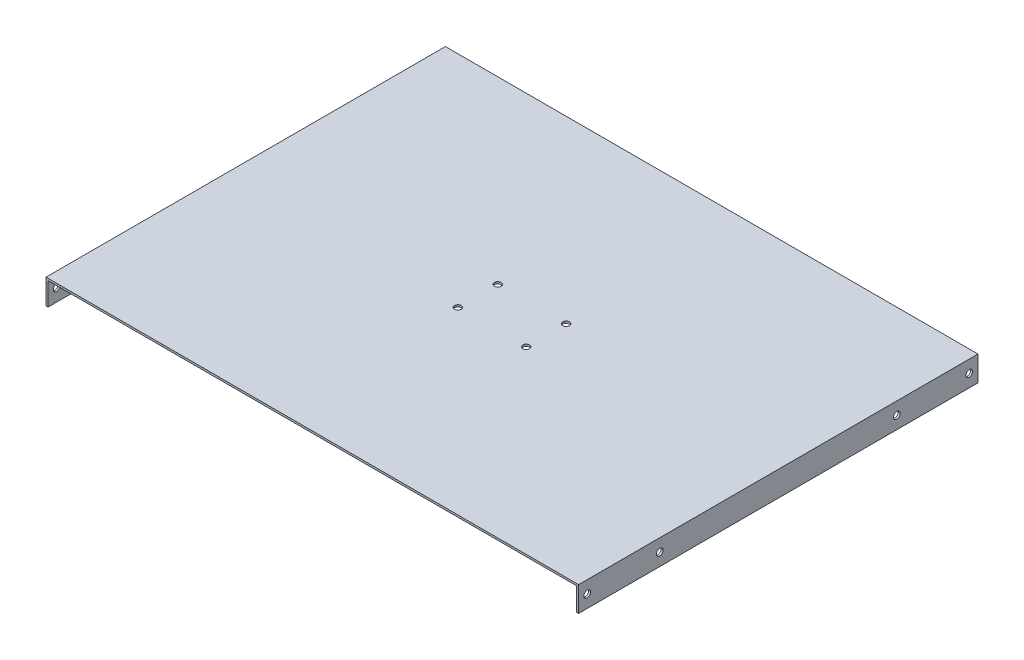
ISO-10303-21;
HEADER;
FILE_DESCRIPTION(('STEP AP214'),'2;1');
FILE_NAME('part.step','',(''),(''),'','','');
FILE_SCHEMA(('AUTOMOTIVE_DESIGN { 1 0 10303 214 1 1 1 1 }'));
ENDSEC;
DATA;
#1=APPLICATION_CONTEXT('core data for automotive mechanical design processes');
#2=APPLICATION_PROTOCOL_DEFINITION('international standard','automotive_design',2000,#1);
#3=PRODUCT_CONTEXT('',#1,'mechanical');
#4=PRODUCT('Part','Part','',(#3));
#5=PRODUCT_RELATED_PRODUCT_CATEGORY('part','',(#4));
#6=PRODUCT_DEFINITION_FORMATION('','',#4);
#7=PRODUCT_DEFINITION_CONTEXT('part definition',#1,'design');
#8=PRODUCT_DEFINITION('design','',#6,#7);
#9=PRODUCT_DEFINITION_SHAPE('','',#8);
#10=(LENGTH_UNIT() NAMED_UNIT(*) SI_UNIT(.MILLI.,.METRE.));
#11=(NAMED_UNIT(*) PLANE_ANGLE_UNIT() SI_UNIT($,.RADIAN.));
#12=(NAMED_UNIT(*) SI_UNIT($,.STERADIAN.) SOLID_ANGLE_UNIT());
#13=UNCERTAINTY_MEASURE_WITH_UNIT(LENGTH_MEASURE(1.E-05),#10,'distance_accuracy_value','');
#14=(GEOMETRIC_REPRESENTATION_CONTEXT(3) GLOBAL_UNCERTAINTY_ASSIGNED_CONTEXT((#13)) GLOBAL_UNIT_ASSIGNED_CONTEXT((#10,
#11,#12)) REPRESENTATION_CONTEXT('',''));
#15=CARTESIAN_POINT('',(0.,0.,0.));
#16=DIRECTION('',(0.,0.,1.));
#17=DIRECTION('',(1.,0.,0.));
#18=AXIS2_PLACEMENT_3D('',#15,#16,#17);
#19=CARTESIAN_POINT('',(0.,15.,0.));
#20=DIRECTION('',(0.,-1.,0.));
#21=DIRECTION('',(0.,0.,-1.));
#22=AXIS2_PLACEMENT_3D('',#19,#20,#21);
#23=PLANE('',#22);
#24=CARTESIAN_POINT('',(20.52,15.,12.));
#25=DIRECTION('',(0.,-1.,0.));
#26=DIRECTION('',(0.,0.,-1.));
#27=AXIS2_PLACEMENT_3D('',#24,#25,#26);
#28=CIRCLE('',#27,2.);
#29=CARTESIAN_POINT('',(20.52,15.,10.));
#30=VERTEX_POINT('',#29);
#31=EDGE_CURVE('E195',#30,#30,#28,.T.);
#32=ORIENTED_EDGE('',*,*,#31,.T.);
#33=EDGE_LOOP('',(#32));
#34=FACE_BOUND('',#33,.T.);
#35=CARTESIAN_POINT('',(-20.52,15.,-12.));
#36=DIRECTION('',(0.,-1.,0.));
#37=DIRECTION('',(0.,0.,-1.));
#38=AXIS2_PLACEMENT_3D('',#35,#36,#37);
#39=CIRCLE('',#38,2.);
#40=CARTESIAN_POINT('',(-20.52,15.,-14.));
#41=VERTEX_POINT('',#40);
#42=EDGE_CURVE('E184',#41,#41,#39,.T.);
#43=ORIENTED_EDGE('',*,*,#42,.T.);
#44=EDGE_LOOP('',(#43));
#45=FACE_BOUND('',#44,.T.);
#46=DIRECTION('',(0.,0.,-1.));
#47=VECTOR('',#46,1.);
#48=CARTESIAN_POINT('',(160.,15.,120.));
#49=LINE('',#48,#47);
#50=CARTESIAN_POINT('',(160.,15.,120.));
#51=VERTEX_POINT('',#50);
#52=CARTESIAN_POINT('',(160.,15.,-120.));
#53=VERTEX_POINT('',#52);
#54=EDGE_CURVE('E151',#51,#53,#49,.T.);
#55=ORIENTED_EDGE('',*,*,#54,.T.);
#56=DIRECTION('',(-1.,0.,0.));
#57=VECTOR('',#56,1.);
#58=CARTESIAN_POINT('',(-160.,15.,-120.));
#59=LINE('',#58,#57);
#60=CARTESIAN_POINT('',(-160.,15.,-120.));
#61=VERTEX_POINT('',#60);
#62=EDGE_CURVE('E93',#53,#61,#59,.T.);
#63=ORIENTED_EDGE('',*,*,#62,.T.);
#64=DIRECTION('',(0.,0.,1.));
#65=VECTOR('',#64,1.);
#66=CARTESIAN_POINT('',(-160.,15.,120.));
#67=LINE('',#66,#65);
#68=CARTESIAN_POINT('',(-160.,15.,120.));
#69=VERTEX_POINT('',#68);
#70=EDGE_CURVE('E157',#61,#69,#67,.T.);
#71=ORIENTED_EDGE('',*,*,#70,.T.);
#72=DIRECTION('',(1.,0.,0.));
#73=VECTOR('',#72,1.);
#74=CARTESIAN_POINT('',(-160.,15.,120.));
#75=LINE('',#74,#73);
#76=EDGE_CURVE('E65',#69,#51,#75,.T.);
#77=ORIENTED_EDGE('',*,*,#76,.T.);
#78=EDGE_LOOP('',(#55,#63,#71,#77));
#79=FACE_BOUND('',#78,.T.);
#80=CARTESIAN_POINT('',(20.52,15.,-12.));
#81=DIRECTION('',(0.,-1.,0.));
#82=DIRECTION('',(0.,0.,-1.));
#83=AXIS2_PLACEMENT_3D('',#80,#81,#82);
#84=CIRCLE('',#83,2.);
#85=CARTESIAN_POINT('',(20.52,15.,-14.));
#86=VERTEX_POINT('',#85);
#87=EDGE_CURVE('E190',#86,#86,#84,.F.);
#88=ORIENTED_EDGE('',*,*,#87,.F.);
#89=EDGE_LOOP('',(#88));
#90=FACE_BOUND('',#89,.T.);
#91=CARTESIAN_POINT('',(-20.52,15.,12.));
#92=DIRECTION('',(0.,-1.,0.));
#93=DIRECTION('',(0.,0.,-1.));
#94=AXIS2_PLACEMENT_3D('',#91,#92,#93);
#95=CIRCLE('',#94,2.);
#96=CARTESIAN_POINT('',(-20.52,15.,10.));
#97=VERTEX_POINT('',#96);
#98=EDGE_CURVE('E200',#97,#97,#95,.F.);
#99=ORIENTED_EDGE('',*,*,#98,.F.);
#100=EDGE_LOOP('',(#99));
#101=FACE_BOUND('',#100,.T.);
#102=ADVANCED_FACE('F38',(#34,#45,#79,#90,#101),#23,.F.);
#103=CARTESIAN_POINT('',(0.,13.8,0.));
#104=DIRECTION('',(0.,-1.,0.));
#105=DIRECTION('',(0.,0.,-1.));
#106=AXIS2_PLACEMENT_3D('',#103,#104,#105);
#107=PLANE('',#106);
#108=CARTESIAN_POINT('',(20.52,13.8,-12.));
#109=DIRECTION('',(0.,-1.,0.));
#110=DIRECTION('',(0.,0.,-1.));
#111=AXIS2_PLACEMENT_3D('',#108,#109,#110);
#112=CIRCLE('',#111,2.);
#113=CARTESIAN_POINT('',(20.52,13.8,-14.));
#114=VERTEX_POINT('',#113);
#115=EDGE_CURVE('E186',#114,#114,#112,.F.);
#116=ORIENTED_EDGE('',*,*,#115,.T.);
#117=EDGE_LOOP('',(#116));
#118=FACE_BOUND('',#117,.T.);
#119=CARTESIAN_POINT('',(-20.52,13.8,-12.));
#120=DIRECTION('',(0.,-1.,0.));
#121=DIRECTION('',(0.,0.,-1.));
#122=AXIS2_PLACEMENT_3D('',#119,#120,#121);
#123=CIRCLE('',#122,2.);
#124=CARTESIAN_POINT('',(-20.52,13.8,-14.));
#125=VERTEX_POINT('',#124);
#126=EDGE_CURVE('E180',#125,#125,#123,.T.);
#127=ORIENTED_EDGE('',*,*,#126,.F.);
#128=EDGE_LOOP('',(#127));
#129=FACE_BOUND('',#128,.T.);
#130=DIRECTION('',(0.,0.,-1.));
#131=VECTOR('',#130,1.);
#132=CARTESIAN_POINT('',(158.8,13.8,120.));
#133=LINE('',#132,#131);
#134=CARTESIAN_POINT('',(158.8,13.8,120.));
#135=VERTEX_POINT('',#134);
#136=CARTESIAN_POINT('',(158.8,13.8,-120.));
#137=VERTEX_POINT('',#136);
#138=EDGE_CURVE('E121',#135,#137,#133,.T.);
#139=ORIENTED_EDGE('',*,*,#138,.F.);
#140=DIRECTION('',(1.,0.,0.));
#141=VECTOR('',#140,1.);
#142=CARTESIAN_POINT('',(-158.8,13.8,120.));
#143=LINE('',#142,#141);
#144=CARTESIAN_POINT('',(-158.8,13.8,120.));
#145=VERTEX_POINT('',#144);
#146=EDGE_CURVE('E266',#145,#135,#143,.T.);
#147=ORIENTED_EDGE('',*,*,#146,.F.);
#148=DIRECTION('',(0.,0.,1.));
#149=VECTOR('',#148,1.);
#150=CARTESIAN_POINT('',(-158.8,13.8,120.));
#151=LINE('',#150,#149);
#152=CARTESIAN_POINT('',(-158.8,13.8,-120.));
#153=VERTEX_POINT('',#152);
#154=EDGE_CURVE('E123',#153,#145,#151,.T.);
#155=ORIENTED_EDGE('',*,*,#154,.F.);
#156=DIRECTION('',(-1.,0.,0.));
#157=VECTOR('',#156,1.);
#158=CARTESIAN_POINT('',(-158.8,13.8,-120.));
#159=LINE('',#158,#157);
#160=EDGE_CURVE('E116',#137,#153,#159,.T.);
#161=ORIENTED_EDGE('',*,*,#160,.F.);
#162=EDGE_LOOP('',(#139,#147,#155,#161));
#163=FACE_BOUND('',#162,.T.);
#164=CARTESIAN_POINT('',(20.52,13.8,12.));
#165=DIRECTION('',(0.,-1.,0.));
#166=DIRECTION('',(0.,0.,-1.));
#167=AXIS2_PLACEMENT_3D('',#164,#165,#166);
#168=CIRCLE('',#167,2.);
#169=CARTESIAN_POINT('',(20.52,13.8,10.));
#170=VERTEX_POINT('',#169);
#171=EDGE_CURVE('E191',#170,#170,#168,.T.);
#172=ORIENTED_EDGE('',*,*,#171,.F.);
#173=EDGE_LOOP('',(#172));
#174=FACE_BOUND('',#173,.T.);
#175=CARTESIAN_POINT('',(-20.52,13.8,12.));
#176=DIRECTION('',(0.,-1.,0.));
#177=DIRECTION('',(0.,0.,-1.));
#178=AXIS2_PLACEMENT_3D('',#175,#176,#177);
#179=CIRCLE('',#178,2.);
#180=CARTESIAN_POINT('',(-20.52,13.8,10.));
#181=VERTEX_POINT('',#180);
#182=EDGE_CURVE('E196',#181,#181,#179,.F.);
#183=ORIENTED_EDGE('',*,*,#182,.T.);
#184=EDGE_LOOP('',(#183));
#185=FACE_BOUND('',#184,.T.);
#186=ADVANCED_FACE('F118',(#118,#129,#163,#174,#185),#107,.T.);
#187=CARTESIAN_POINT('',(-160.,15.,-120.));
#188=DIRECTION('',(0.,0.,1.));
#189=DIRECTION('',(1.,0.,0.));
#190=AXIS2_PLACEMENT_3D('',#187,#188,#189);
#191=PLANE('',#190);
#192=DIRECTION('',(0.,-1.,0.));
#193=VECTOR('',#192,1.);
#194=CARTESIAN_POINT('',(158.8,13.8,-120.));
#195=LINE('',#194,#193);
#196=CARTESIAN_POINT('',(158.8,0.,-120.));
#197=VERTEX_POINT('',#196);
#198=EDGE_CURVE('E130',#137,#197,#195,.T.);
#199=ORIENTED_EDGE('',*,*,#198,.F.);
#200=ORIENTED_EDGE('',*,*,#160,.T.);
#201=DIRECTION('',(0.,-1.,0.));
#202=VECTOR('',#201,1.);
#203=CARTESIAN_POINT('',(-158.8,13.8,-120.));
#204=LINE('',#203,#202);
#205=CARTESIAN_POINT('',(-158.8,0.,-120.));
#206=VERTEX_POINT('',#205);
#207=EDGE_CURVE('E141',#153,#206,#204,.T.);
#208=ORIENTED_EDGE('',*,*,#207,.T.);
#209=DIRECTION('',(-1.,0.,0.));
#210=VECTOR('',#209,1.);
#211=CARTESIAN_POINT('',(-160.,0.,-120.));
#212=LINE('',#211,#210);
#213=CARTESIAN_POINT('',(-160.,0.,-120.));
#214=VERTEX_POINT('',#213);
#215=EDGE_CURVE('E146',#206,#214,#212,.T.);
#216=ORIENTED_EDGE('',*,*,#215,.T.);
#217=DIRECTION('',(0.,-1.,0.));
#218=VECTOR('',#217,1.);
#219=CARTESIAN_POINT('',(-160.,15.,-120.));
#220=LINE('',#219,#218);
#221=EDGE_CURVE('E48',#61,#214,#220,.T.);
#222=ORIENTED_EDGE('',*,*,#221,.F.);
#223=ORIENTED_EDGE('',*,*,#62,.F.);
#224=DIRECTION('',(0.,-1.,0.));
#225=VECTOR('',#224,1.);
#226=CARTESIAN_POINT('',(160.,15.,-120.));
#227=LINE('',#226,#225);
#228=CARTESIAN_POINT('',(160.,0.,-120.));
#229=VERTEX_POINT('',#228);
#230=EDGE_CURVE('E11',#53,#229,#227,.T.);
#231=ORIENTED_EDGE('',*,*,#230,.T.);
#232=EDGE_CURVE('E138',#229,#197,#212,.T.);
#233=ORIENTED_EDGE('',*,*,#232,.T.);
#234=EDGE_LOOP('',(#199,#200,#208,#216,#222,#223,#231,#233));
#235=FACE_BOUND('',#234,.T.);
#236=ADVANCED_FACE('F137',(#235),#191,.F.);
#237=CARTESIAN_POINT('',(-160.,15.,120.));
#238=DIRECTION('',(0.,0.,-1.));
#239=DIRECTION('',(-1.,0.,0.));
#240=AXIS2_PLACEMENT_3D('',#237,#238,#239);
#241=PLANE('',#240);
#242=DIRECTION('',(0.,-1.,0.));
#243=VECTOR('',#242,1.);
#244=CARTESIAN_POINT('',(158.8,13.8,120.));
#245=LINE('',#244,#243);
#246=CARTESIAN_POINT('',(158.8,0.,120.));
#247=VERTEX_POINT('',#246);
#248=EDGE_CURVE('E132',#135,#247,#245,.T.);
#249=ORIENTED_EDGE('',*,*,#248,.T.);
#250=DIRECTION('',(1.,0.,0.));
#251=VECTOR('',#250,1.);
#252=CARTESIAN_POINT('',(-160.,0.,120.));
#253=LINE('',#252,#251);
#254=CARTESIAN_POINT('',(160.,0.,120.));
#255=VERTEX_POINT('',#254);
#256=EDGE_CURVE('E86',#247,#255,#253,.T.);
#257=ORIENTED_EDGE('',*,*,#256,.T.);
#258=DIRECTION('',(0.,-1.,0.));
#259=VECTOR('',#258,1.);
#260=CARTESIAN_POINT('',(160.,15.,120.));
#261=LINE('',#260,#259);
#262=EDGE_CURVE('E161',#51,#255,#261,.T.);
#263=ORIENTED_EDGE('',*,*,#262,.F.);
#264=ORIENTED_EDGE('',*,*,#76,.F.);
#265=DIRECTION('',(0.,-1.,0.));
#266=VECTOR('',#265,1.);
#267=CARTESIAN_POINT('',(-160.,15.,120.));
#268=LINE('',#267,#266);
#269=CARTESIAN_POINT('',(-160.,0.,120.));
#270=VERTEX_POINT('',#269);
#271=EDGE_CURVE('E173',#69,#270,#268,.T.);
#272=ORIENTED_EDGE('',*,*,#271,.T.);
#273=CARTESIAN_POINT('',(-158.8,0.,120.));
#274=VERTEX_POINT('',#273);
#275=EDGE_CURVE('E154',#270,#274,#253,.T.);
#276=ORIENTED_EDGE('',*,*,#275,.T.);
#277=DIRECTION('',(0.,-1.,0.));
#278=VECTOR('',#277,1.);
#279=CARTESIAN_POINT('',(-158.8,13.8,120.));
#280=LINE('',#279,#278);
#281=EDGE_CURVE('E56',#145,#274,#280,.T.);
#282=ORIENTED_EDGE('',*,*,#281,.F.);
#283=ORIENTED_EDGE('',*,*,#146,.T.);
#284=EDGE_LOOP('',(#249,#257,#263,#264,#272,#276,#282,#283));
#285=FACE_BOUND('',#284,.T.);
#286=ADVANCED_FACE('F308',(#285),#241,.F.);
#287=CARTESIAN_POINT('',(0.,0.,0.));
#288=DIRECTION('',(0.,-1.,0.));
#289=DIRECTION('',(0.,0.,-1.));
#290=AXIS2_PLACEMENT_3D('',#287,#288,#289);
#291=PLANE('',#290);
#292=ORIENTED_EDGE('',*,*,#256,.F.);
#293=DIRECTION('',(0.,0.,-1.));
#294=VECTOR('',#293,1.);
#295=CARTESIAN_POINT('',(158.8,0.,120.));
#296=LINE('',#295,#294);
#297=EDGE_CURVE('E262',#247,#197,#296,.T.);
#298=ORIENTED_EDGE('',*,*,#297,.T.);
#299=ORIENTED_EDGE('',*,*,#232,.F.);
#300=DIRECTION('',(0.,0.,-1.));
#301=VECTOR('',#300,1.);
#302=CARTESIAN_POINT('',(160.,0.,120.));
#303=LINE('',#302,#301);
#304=EDGE_CURVE('E140',#255,#229,#303,.T.);
#305=ORIENTED_EDGE('',*,*,#304,.F.);
#306=EDGE_LOOP('',(#292,#298,#299,#305));
#307=FACE_BOUND('',#306,.T.);
#308=ADVANCED_FACE('F318',(#307),#291,.T.);
#309=ORIENTED_EDGE('',*,*,#215,.F.);
#310=DIRECTION('',(0.,0.,1.));
#311=VECTOR('',#310,1.);
#312=CARTESIAN_POINT('',(-158.8,0.,120.));
#313=LINE('',#312,#311);
#314=EDGE_CURVE('E134',#206,#274,#313,.T.);
#315=ORIENTED_EDGE('',*,*,#314,.T.);
#316=ORIENTED_EDGE('',*,*,#275,.F.);
#317=DIRECTION('',(0.,0.,1.));
#318=VECTOR('',#317,1.);
#319=CARTESIAN_POINT('',(-160.,0.,120.));
#320=LINE('',#319,#318);
#321=EDGE_CURVE('E165',#214,#270,#320,.T.);
#322=ORIENTED_EDGE('',*,*,#321,.F.);
#323=EDGE_LOOP('',(#309,#315,#316,#322));
#324=FACE_BOUND('',#323,.T.);
#325=ADVANCED_FACE('F309',(#324),#291,.T.);
#326=CARTESIAN_POINT('',(160.,15.,120.));
#327=DIRECTION('',(-1.,0.,0.));
#328=DIRECTION('',(0.,0.,1.));
#329=AXIS2_PLACEMENT_3D('',#326,#327,#328);
#330=PLANE('',#329);
#331=CARTESIAN_POINT('',(160.,7.5,-114.8));
#332=DIRECTION('',(-1.,0.,0.));
#333=DIRECTION('',(0.,0.,1.));
#334=AXIS2_PLACEMENT_3D('',#331,#332,#333);
#335=CIRCLE('',#334,2.);
#336=CARTESIAN_POINT('',(160.,7.5,-112.8));
#337=VERTEX_POINT('',#336);
#338=EDGE_CURVE('E185',#337,#337,#335,.F.);
#339=ORIENTED_EDGE('',*,*,#338,.F.);
#340=EDGE_LOOP('',(#339));
#341=FACE_BOUND('',#340,.T.);
#342=CARTESIAN_POINT('',(160.,7.5,71.2));
#343=DIRECTION('',(-1.,0.,0.));
#344=DIRECTION('',(0.,0.,1.));
#345=AXIS2_PLACEMENT_3D('',#342,#343,#344);
#346=CIRCLE('',#345,2.);
#347=CARTESIAN_POINT('',(160.,7.5,73.2));
#348=VERTEX_POINT('',#347);
#349=EDGE_CURVE('E236',#348,#348,#346,.F.);
#350=ORIENTED_EDGE('',*,*,#349,.F.);
#351=EDGE_LOOP('',(#350));
#352=FACE_BOUND('',#351,.T.);
#353=CARTESIAN_POINT('',(160.,7.5,114.8));
#354=DIRECTION('',(-1.,0.,0.));
#355=DIRECTION('',(0.,0.,1.));
#356=AXIS2_PLACEMENT_3D('',#353,#354,#355);
#357=CIRCLE('',#356,2.);
#358=CARTESIAN_POINT('',(160.,7.5,116.8));
#359=VERTEX_POINT('',#358);
#360=EDGE_CURVE('E215',#359,#359,#357,.F.);
#361=ORIENTED_EDGE('',*,*,#360,.F.);
#362=EDGE_LOOP('',(#361));
#363=FACE_BOUND('',#362,.T.);
#364=CARTESIAN_POINT('',(160.,7.5,-71.2));
#365=DIRECTION('',(-1.,0.,0.));
#366=DIRECTION('',(0.,0.,1.));
#367=AXIS2_PLACEMENT_3D('',#364,#365,#366);
#368=CIRCLE('',#367,2.);
#369=CARTESIAN_POINT('',(160.,7.5,-69.2));
#370=VERTEX_POINT('',#369);
#371=EDGE_CURVE('E210',#370,#370,#368,.F.);
#372=ORIENTED_EDGE('',*,*,#371,.F.);
#373=EDGE_LOOP('',(#372));
#374=FACE_BOUND('',#373,.T.);
#375=ORIENTED_EDGE('',*,*,#304,.T.);
#376=ORIENTED_EDGE('',*,*,#230,.F.);
#377=ORIENTED_EDGE('',*,*,#54,.F.);
#378=ORIENTED_EDGE('',*,*,#262,.T.);
#379=EDGE_LOOP('',(#375,#376,#377,#378));
#380=FACE_BOUND('',#379,.T.);
#381=ADVANCED_FACE('F40',(#341,#352,#363,#374,#380),#330,.F.);
#382=CARTESIAN_POINT('',(-160.,15.,120.));
#383=DIRECTION('',(1.,0.,0.));
#384=DIRECTION('',(0.,0.,-1.));
#385=AXIS2_PLACEMENT_3D('',#382,#383,#384);
#386=PLANE('',#385);
#387=CARTESIAN_POINT('',(-160.,7.5,-114.8));
#388=DIRECTION('',(1.,0.,0.));
#389=DIRECTION('',(0.,0.,-1.));
#390=AXIS2_PLACEMENT_3D('',#387,#388,#389);
#391=CIRCLE('',#390,2.);
#392=CARTESIAN_POINT('',(-160.,7.5,-116.8));
#393=VERTEX_POINT('',#392);
#394=EDGE_CURVE('E244',#393,#393,#391,.F.);
#395=ORIENTED_EDGE('',*,*,#394,.F.);
#396=EDGE_LOOP('',(#395));
#397=FACE_BOUND('',#396,.T.);
#398=CARTESIAN_POINT('',(-160.,7.5,71.2));
#399=DIRECTION('',(1.,0.,0.));
#400=DIRECTION('',(0.,0.,-1.));
#401=AXIS2_PLACEMENT_3D('',#398,#399,#400);
#402=CIRCLE('',#401,2.);
#403=CARTESIAN_POINT('',(-160.,7.5,69.2));
#404=VERTEX_POINT('',#403);
#405=EDGE_CURVE('E221',#404,#404,#402,.F.);
#406=ORIENTED_EDGE('',*,*,#405,.F.);
#407=EDGE_LOOP('',(#406));
#408=FACE_BOUND('',#407,.T.);
#409=CARTESIAN_POINT('',(-160.,7.5,114.8));
#410=DIRECTION('',(1.,0.,0.));
#411=DIRECTION('',(0.,0.,-1.));
#412=AXIS2_PLACEMENT_3D('',#409,#410,#411);
#413=CIRCLE('',#412,2.);
#414=CARTESIAN_POINT('',(-160.,7.5,112.8));
#415=VERTEX_POINT('',#414);
#416=EDGE_CURVE('E224',#415,#415,#413,.F.);
#417=ORIENTED_EDGE('',*,*,#416,.F.);
#418=EDGE_LOOP('',(#417));
#419=FACE_BOUND('',#418,.T.);
#420=CARTESIAN_POINT('',(-160.,7.5,-71.2));
#421=DIRECTION('',(1.,0.,0.));
#422=DIRECTION('',(0.,0.,-1.));
#423=AXIS2_PLACEMENT_3D('',#420,#421,#422);
#424=CIRCLE('',#423,2.);
#425=CARTESIAN_POINT('',(-160.,7.5,-73.2));
#426=VERTEX_POINT('',#425);
#427=EDGE_CURVE('E301',#426,#426,#424,.F.);
#428=ORIENTED_EDGE('',*,*,#427,.F.);
#429=EDGE_LOOP('',(#428));
#430=FACE_BOUND('',#429,.T.);
#431=ORIENTED_EDGE('',*,*,#321,.T.);
#432=ORIENTED_EDGE('',*,*,#271,.F.);
#433=ORIENTED_EDGE('',*,*,#70,.F.);
#434=ORIENTED_EDGE('',*,*,#221,.T.);
#435=EDGE_LOOP('',(#431,#432,#433,#434));
#436=FACE_BOUND('',#435,.T.);
#437=ADVANCED_FACE('F290',(#397,#408,#419,#430,#436),#386,.F.);
#438=CARTESIAN_POINT('',(158.8,13.8,120.));
#439=DIRECTION('',(-1.,0.,0.));
#440=DIRECTION('',(0.,0.,1.));
#441=AXIS2_PLACEMENT_3D('',#438,#439,#440);
#442=PLANE('',#441);
#443=CARTESIAN_POINT('',(158.8,7.5,-114.8));
#444=DIRECTION('',(-1.,0.,0.));
#445=DIRECTION('',(0.,0.,1.));
#446=AXIS2_PLACEMENT_3D('',#443,#444,#445);
#447=CIRCLE('',#446,2.);
#448=CARTESIAN_POINT('',(158.8,7.5,-112.8));
#449=VERTEX_POINT('',#448);
#450=EDGE_CURVE('E240',#449,#449,#447,.F.);
#451=ORIENTED_EDGE('',*,*,#450,.T.);
#452=EDGE_LOOP('',(#451));
#453=FACE_BOUND('',#452,.T.);
#454=CARTESIAN_POINT('',(158.8,7.5,71.2));
#455=DIRECTION('',(-1.,0.,0.));
#456=DIRECTION('',(0.,0.,1.));
#457=AXIS2_PLACEMENT_3D('',#454,#455,#456);
#458=CIRCLE('',#457,2.);
#459=CARTESIAN_POINT('',(158.8,7.5,73.2));
#460=VERTEX_POINT('',#459);
#461=EDGE_CURVE('E214',#460,#460,#458,.F.);
#462=ORIENTED_EDGE('',*,*,#461,.T.);
#463=EDGE_LOOP('',(#462));
#464=FACE_BOUND('',#463,.T.);
#465=CARTESIAN_POINT('',(158.8,7.5,114.8));
#466=DIRECTION('',(-1.,0.,0.));
#467=DIRECTION('',(0.,0.,1.));
#468=AXIS2_PLACEMENT_3D('',#465,#466,#467);
#469=CIRCLE('',#468,2.);
#470=CARTESIAN_POINT('',(158.8,7.5,116.8));
#471=VERTEX_POINT('',#470);
#472=EDGE_CURVE('E209',#471,#471,#469,.F.);
#473=ORIENTED_EDGE('',*,*,#472,.T.);
#474=EDGE_LOOP('',(#473));
#475=FACE_BOUND('',#474,.T.);
#476=CARTESIAN_POINT('',(158.8,7.5,-71.2));
#477=DIRECTION('',(-1.,0.,0.));
#478=DIRECTION('',(0.,0.,1.));
#479=AXIS2_PLACEMENT_3D('',#476,#477,#478);
#480=CIRCLE('',#479,2.);
#481=CARTESIAN_POINT('',(158.8,7.5,-69.2));
#482=VERTEX_POINT('',#481);
#483=EDGE_CURVE('E205',#482,#482,#480,.F.);
#484=ORIENTED_EDGE('',*,*,#483,.T.);
#485=EDGE_LOOP('',(#484));
#486=FACE_BOUND('',#485,.T.);
#487=ORIENTED_EDGE('',*,*,#297,.F.);
#488=ORIENTED_EDGE('',*,*,#248,.F.);
#489=ORIENTED_EDGE('',*,*,#138,.T.);
#490=ORIENTED_EDGE('',*,*,#198,.T.);
#491=EDGE_LOOP('',(#487,#488,#489,#490));
#492=FACE_BOUND('',#491,.T.);
#493=ADVANCED_FACE('F129',(#453,#464,#475,#486,#492),#442,.T.);
#494=CARTESIAN_POINT('',(-158.8,13.8,120.));
#495=DIRECTION('',(1.,0.,0.));
#496=DIRECTION('',(0.,0.,-1.));
#497=AXIS2_PLACEMENT_3D('',#494,#495,#496);
#498=PLANE('',#497);
#499=CARTESIAN_POINT('',(-158.8,7.5,-114.8));
#500=DIRECTION('',(1.,0.,0.));
#501=DIRECTION('',(0.,0.,-1.));
#502=AXIS2_PLACEMENT_3D('',#499,#500,#501);
#503=CIRCLE('',#502,2.);
#504=CARTESIAN_POINT('',(-158.8,7.5,-116.8));
#505=VERTEX_POINT('',#504);
#506=EDGE_CURVE('E42',#505,#505,#503,.F.);
#507=ORIENTED_EDGE('',*,*,#506,.T.);
#508=EDGE_LOOP('',(#507));
#509=FACE_BOUND('',#508,.T.);
#510=CARTESIAN_POINT('',(-158.8,7.5,71.2));
#511=DIRECTION('',(1.,0.,0.));
#512=DIRECTION('',(0.,0.,-1.));
#513=AXIS2_PLACEMENT_3D('',#510,#511,#512);
#514=CIRCLE('',#513,2.);
#515=CARTESIAN_POINT('',(-158.8,7.5,69.2));
#516=VERTEX_POINT('',#515);
#517=EDGE_CURVE('E211',#516,#516,#514,.F.);
#518=ORIENTED_EDGE('',*,*,#517,.T.);
#519=EDGE_LOOP('',(#518));
#520=FACE_BOUND('',#519,.T.);
#521=CARTESIAN_POINT('',(-158.8,7.5,114.8));
#522=DIRECTION('',(1.,0.,0.));
#523=DIRECTION('',(0.,0.,-1.));
#524=AXIS2_PLACEMENT_3D('',#521,#522,#523);
#525=CIRCLE('',#524,2.);
#526=CARTESIAN_POINT('',(-158.8,7.5,112.8));
#527=VERTEX_POINT('',#526);
#528=EDGE_CURVE('E206',#527,#527,#525,.F.);
#529=ORIENTED_EDGE('',*,*,#528,.T.);
#530=EDGE_LOOP('',(#529));
#531=FACE_BOUND('',#530,.T.);
#532=CARTESIAN_POINT('',(-158.8,7.5,-71.2));
#533=DIRECTION('',(1.,0.,0.));
#534=DIRECTION('',(0.,0.,-1.));
#535=AXIS2_PLACEMENT_3D('',#532,#533,#534);
#536=CIRCLE('',#535,2.);
#537=CARTESIAN_POINT('',(-158.8,7.5,-73.2));
#538=VERTEX_POINT('',#537);
#539=EDGE_CURVE('E201',#538,#538,#536,.F.);
#540=ORIENTED_EDGE('',*,*,#539,.T.);
#541=EDGE_LOOP('',(#540));
#542=FACE_BOUND('',#541,.T.);
#543=ORIENTED_EDGE('',*,*,#314,.F.);
#544=ORIENTED_EDGE('',*,*,#207,.F.);
#545=ORIENTED_EDGE('',*,*,#154,.T.);
#546=ORIENTED_EDGE('',*,*,#281,.T.);
#547=EDGE_LOOP('',(#543,#544,#545,#546));
#548=FACE_BOUND('',#547,.T.);
#549=ADVANCED_FACE('F279',(#509,#520,#531,#542,#548),#498,.T.);
#550=CARTESIAN_POINT('',(-20.52,23.8,-12.));
#551=DIRECTION('',(0.,-1.,0.));
#552=DIRECTION('',(0.,0.,-1.));
#553=AXIS2_PLACEMENT_3D('',#550,#551,#552);
#554=CYLINDRICAL_SURFACE('',#553,2.);
#555=CARTESIAN_POINT('',(-20.52,13.8,-14.));
#556=CARTESIAN_POINT('',(-20.52,13.8125,-14.));
#557=CARTESIAN_POINT('',(-20.52,13.825,-14.));
#558=CARTESIAN_POINT('',(-20.52,13.85,-14.));
#559=CARTESIAN_POINT('',(-20.52,13.8625,-14.));
#560=CARTESIAN_POINT('',(-20.52,13.8875,-14.));
#561=CARTESIAN_POINT('',(-20.52,13.9,-14.));
#562=CARTESIAN_POINT('',(-20.52,13.925,-14.));
#563=CARTESIAN_POINT('',(-20.52,13.9375,-14.));
#564=CARTESIAN_POINT('',(-20.52,13.9625,-14.));
#565=CARTESIAN_POINT('',(-20.52,13.975,-14.));
#566=CARTESIAN_POINT('',(-20.52,14.,-14.));
#567=CARTESIAN_POINT('',(-20.52,14.0125,-14.));
#568=CARTESIAN_POINT('',(-20.52,14.0375,-14.));
#569=CARTESIAN_POINT('',(-20.52,14.05,-14.));
#570=CARTESIAN_POINT('',(-20.52,14.075,-14.));
#571=CARTESIAN_POINT('',(-20.52,14.0875,-14.));
#572=CARTESIAN_POINT('',(-20.52,14.1125,-14.));
#573=CARTESIAN_POINT('',(-20.52,14.125,-14.));
#574=CARTESIAN_POINT('',(-20.52,14.15,-14.));
#575=CARTESIAN_POINT('',(-20.52,14.1625,-14.));
#576=CARTESIAN_POINT('',(-20.52,14.1875,-14.));
#577=CARTESIAN_POINT('',(-20.52,14.2,-14.));
#578=CARTESIAN_POINT('',(-20.52,14.225,-14.));
#579=CARTESIAN_POINT('',(-20.52,14.2375,-14.));
#580=CARTESIAN_POINT('',(-20.52,14.2625,-14.));
#581=CARTESIAN_POINT('',(-20.52,14.275,-14.));
#582=CARTESIAN_POINT('',(-20.52,14.3,-14.));
#583=CARTESIAN_POINT('',(-20.52,14.3125,-14.));
#584=CARTESIAN_POINT('',(-20.52,14.3375,-14.));
#585=CARTESIAN_POINT('',(-20.52,14.35,-14.));
#586=CARTESIAN_POINT('',(-20.52,14.375,-14.));
#587=CARTESIAN_POINT('',(-20.52,14.3875,-14.));
#588=CARTESIAN_POINT('',(-20.52,14.4125,-14.));
#589=CARTESIAN_POINT('',(-20.52,14.425,-14.));
#590=CARTESIAN_POINT('',(-20.52,14.45,-14.));
#591=CARTESIAN_POINT('',(-20.52,14.4625,-14.));
#592=CARTESIAN_POINT('',(-20.52,14.4875,-14.));
#593=CARTESIAN_POINT('',(-20.52,14.5,-14.));
#594=CARTESIAN_POINT('',(-20.52,14.525,-14.));
#595=CARTESIAN_POINT('',(-20.52,14.5375,-14.));
#596=CARTESIAN_POINT('',(-20.52,14.5625,-14.));
#597=CARTESIAN_POINT('',(-20.52,14.575,-14.));
#598=CARTESIAN_POINT('',(-20.52,14.6,-14.));
#599=CARTESIAN_POINT('',(-20.52,14.6125,-14.));
#600=CARTESIAN_POINT('',(-20.52,14.6375,-14.));
#601=CARTESIAN_POINT('',(-20.52,14.65,-14.));
#602=CARTESIAN_POINT('',(-20.52,14.675,-14.));
#603=CARTESIAN_POINT('',(-20.52,14.6875,-14.));
#604=CARTESIAN_POINT('',(-20.52,14.7125,-14.));
#605=CARTESIAN_POINT('',(-20.52,14.725,-14.));
#606=CARTESIAN_POINT('',(-20.52,14.75,-14.));
#607=CARTESIAN_POINT('',(-20.52,14.7625,-14.));
#608=CARTESIAN_POINT('',(-20.52,14.7875,-14.));
#609=CARTESIAN_POINT('',(-20.52,14.8,-14.));
#610=CARTESIAN_POINT('',(-20.52,14.825,-14.));
#611=CARTESIAN_POINT('',(-20.52,14.8375,-14.));
#612=CARTESIAN_POINT('',(-20.52,14.8625,-14.));
#613=CARTESIAN_POINT('',(-20.52,14.875,-14.));
#614=CARTESIAN_POINT('',(-20.52,14.9,-14.));
#615=CARTESIAN_POINT('',(-20.52,14.9125,-14.));
#616=CARTESIAN_POINT('',(-20.52,14.9375,-14.));
#617=CARTESIAN_POINT('',(-20.52,14.95,-14.));
#618=CARTESIAN_POINT('',(-20.52,14.975,-14.));
#619=CARTESIAN_POINT('',(-20.52,14.9875,-14.));
#620=CARTESIAN_POINT('',(-20.52,15.,-14.));
#621=B_SPLINE_CURVE_WITH_KNOTS('',3,(#555,#556,#557,#558,#559,#560,#561,#562,#563,#564,#565,
#566,#567,#568,#569,#570,#571,#572,#573,#574,#575,#576,#577,#578,#579,#580,#581,#582,#583,#584,
#585,#586,#587,#588,#589,#590,#591,#592,#593,#594,#595,#596,#597,#598,#599,#600,#601,#602,#603,
#604,#605,#606,#607,#608,#609,#610,#611,#612,#613,#614,#615,#616,#617,#618,#619,#620),
.UNSPECIFIED.,.F.,.F.,(4,2,2,2,2,2,2,2,2,2,2,2,2,2,2,2,2,2,2,2,2,2,2,2,2,2,2,2,2,2,2,2,4),(0.,
0.0374999999999993,0.0750000000000004,0.1125,0.150000000000001,0.1875,0.225,0.262500000000001,
0.3,0.337499999999999,0.375,0.4125,0.449999999999999,0.4875,0.524999999999999,0.5625,0.6,
0.637499999999999,0.675,0.7125,0.750000000000001,0.7875,0.824999999999999,0.8625,0.9,
0.937499999999999,0.975,1.0125,1.05,1.0875,1.125,1.1625,1.2),.UNSPECIFIED.);
#622=EDGE_CURVE('BSEAM341',#125,#41,#621,.T.);
#623=ORIENTED_EDGE('',*,*,#126,.T.);
#624=ORIENTED_EDGE('',*,*,#42,.F.);
#625=ORIENTED_EDGE('',*,*,#622,.T.);
#626=ORIENTED_EDGE('',*,*,#622,.F.);
#627=EDGE_LOOP('',(#623,#625,#624,#626));
#628=FACE_BOUND('',#627,.T.);
#629=ADVANCED_FACE('F341',(#628),#554,.F.);
#630=CARTESIAN_POINT('',(20.52,23.8,-12.));
#631=DIRECTION('',(0.,-1.,0.));
#632=DIRECTION('',(0.,0.,-1.));
#633=AXIS2_PLACEMENT_3D('',#630,#631,#632);
#634=CYLINDRICAL_SURFACE('',#633,2.);
#635=CARTESIAN_POINT('',(20.52,13.8,-14.));
#636=CARTESIAN_POINT('',(20.52,13.8125,-14.));
#637=CARTESIAN_POINT('',(20.52,13.825,-14.));
#638=CARTESIAN_POINT('',(20.52,13.85,-14.));
#639=CARTESIAN_POINT('',(20.52,13.8625,-14.));
#640=CARTESIAN_POINT('',(20.52,13.8875,-14.));
#641=CARTESIAN_POINT('',(20.52,13.9,-14.));
#642=CARTESIAN_POINT('',(20.52,13.925,-14.));
#643=CARTESIAN_POINT('',(20.52,13.9375,-14.));
#644=CARTESIAN_POINT('',(20.52,13.9625,-14.));
#645=CARTESIAN_POINT('',(20.52,13.975,-14.));
#646=CARTESIAN_POINT('',(20.52,14.,-14.));
#647=CARTESIAN_POINT('',(20.52,14.0125,-14.));
#648=CARTESIAN_POINT('',(20.52,14.0375,-14.));
#649=CARTESIAN_POINT('',(20.52,14.05,-14.));
#650=CARTESIAN_POINT('',(20.52,14.075,-14.));
#651=CARTESIAN_POINT('',(20.52,14.0875,-14.));
#652=CARTESIAN_POINT('',(20.52,14.1125,-14.));
#653=CARTESIAN_POINT('',(20.52,14.125,-14.));
#654=CARTESIAN_POINT('',(20.52,14.15,-14.));
#655=CARTESIAN_POINT('',(20.52,14.1625,-14.));
#656=CARTESIAN_POINT('',(20.52,14.1875,-14.));
#657=CARTESIAN_POINT('',(20.52,14.2,-14.));
#658=CARTESIAN_POINT('',(20.52,14.225,-14.));
#659=CARTESIAN_POINT('',(20.52,14.2375,-14.));
#660=CARTESIAN_POINT('',(20.52,14.2625,-14.));
#661=CARTESIAN_POINT('',(20.52,14.275,-14.));
#662=CARTESIAN_POINT('',(20.52,14.3,-14.));
#663=CARTESIAN_POINT('',(20.52,14.3125,-14.));
#664=CARTESIAN_POINT('',(20.52,14.3375,-14.));
#665=CARTESIAN_POINT('',(20.52,14.35,-14.));
#666=CARTESIAN_POINT('',(20.52,14.375,-14.));
#667=CARTESIAN_POINT('',(20.52,14.3875,-14.));
#668=CARTESIAN_POINT('',(20.52,14.4125,-14.));
#669=CARTESIAN_POINT('',(20.52,14.425,-14.));
#670=CARTESIAN_POINT('',(20.52,14.45,-14.));
#671=CARTESIAN_POINT('',(20.52,14.4625,-14.));
#672=CARTESIAN_POINT('',(20.52,14.4875,-14.));
#673=CARTESIAN_POINT('',(20.52,14.5,-14.));
#674=CARTESIAN_POINT('',(20.52,14.525,-14.));
#675=CARTESIAN_POINT('',(20.52,14.5375,-14.));
#676=CARTESIAN_POINT('',(20.52,14.5625,-14.));
#677=CARTESIAN_POINT('',(20.52,14.575,-14.));
#678=CARTESIAN_POINT('',(20.52,14.6,-14.));
#679=CARTESIAN_POINT('',(20.52,14.6125,-14.));
#680=CARTESIAN_POINT('',(20.52,14.6375,-14.));
#681=CARTESIAN_POINT('',(20.52,14.65,-14.));
#682=CARTESIAN_POINT('',(20.52,14.675,-14.));
#683=CARTESIAN_POINT('',(20.52,14.6875,-14.));
#684=CARTESIAN_POINT('',(20.52,14.7125,-14.));
#685=CARTESIAN_POINT('',(20.52,14.725,-14.));
#686=CARTESIAN_POINT('',(20.52,14.75,-14.));
#687=CARTESIAN_POINT('',(20.52,14.7625,-14.));
#688=CARTESIAN_POINT('',(20.52,14.7875,-14.));
#689=CARTESIAN_POINT('',(20.52,14.8,-14.));
#690=CARTESIAN_POINT('',(20.52,14.825,-14.));
#691=CARTESIAN_POINT('',(20.52,14.8375,-14.));
#692=CARTESIAN_POINT('',(20.52,14.8625,-14.));
#693=CARTESIAN_POINT('',(20.52,14.875,-14.));
#694=CARTESIAN_POINT('',(20.52,14.9,-14.));
#695=CARTESIAN_POINT('',(20.52,14.9125,-14.));
#696=CARTESIAN_POINT('',(20.52,14.9375,-14.));
#697=CARTESIAN_POINT('',(20.52,14.95,-14.));
#698=CARTESIAN_POINT('',(20.52,14.975,-14.));
#699=CARTESIAN_POINT('',(20.52,14.9875,-14.));
#700=CARTESIAN_POINT('',(20.52,15.,-14.));
#701=B_SPLINE_CURVE_WITH_KNOTS('',3,(#635,#636,#637,#638,#639,#640,#641,#642,#643,#644,#645,
#646,#647,#648,#649,#650,#651,#652,#653,#654,#655,#656,#657,#658,#659,#660,#661,#662,#663,#664,
#665,#666,#667,#668,#669,#670,#671,#672,#673,#674,#675,#676,#677,#678,#679,#680,#681,#682,#683,
#684,#685,#686,#687,#688,#689,#690,#691,#692,#693,#694,#695,#696,#697,#698,#699,#700),
.UNSPECIFIED.,.F.,.F.,(4,2,2,2,2,2,2,2,2,2,2,2,2,2,2,2,2,2,2,2,2,2,2,2,2,2,2,2,2,2,2,2,4),(0.,
0.0374999999999993,0.0750000000000004,0.1125,0.150000000000001,0.1875,0.225,0.262500000000001,
0.3,0.337499999999999,0.375,0.4125,0.449999999999999,0.4875,0.524999999999999,0.5625,0.6,
0.637499999999999,0.675,0.7125,0.750000000000001,0.7875,0.824999999999999,0.8625,0.9,
0.937499999999999,0.975,1.0125,1.05,1.0875,1.125,1.1625,1.2),.UNSPECIFIED.);
#702=EDGE_CURVE('BSEAM345',#114,#86,#701,.T.);
#703=ORIENTED_EDGE('',*,*,#115,.F.);
#704=ORIENTED_EDGE('',*,*,#87,.T.);
#705=ORIENTED_EDGE('',*,*,#702,.T.);
#706=ORIENTED_EDGE('',*,*,#702,.F.);
#707=EDGE_LOOP('',(#703,#705,#704,#706));
#708=FACE_BOUND('',#707,.T.);
#709=ADVANCED_FACE('F345',(#708),#634,.F.);
#710=CARTESIAN_POINT('',(20.52,23.8,12.));
#711=DIRECTION('',(0.,-1.,0.));
#712=DIRECTION('',(0.,0.,-1.));
#713=AXIS2_PLACEMENT_3D('',#710,#711,#712);
#714=CYLINDRICAL_SURFACE('',#713,2.);
#715=CARTESIAN_POINT('',(20.52,13.8,10.));
#716=CARTESIAN_POINT('',(20.52,13.8125,10.));
#717=CARTESIAN_POINT('',(20.52,13.825,10.));
#718=CARTESIAN_POINT('',(20.52,13.85,10.));
#719=CARTESIAN_POINT('',(20.52,13.8625,10.));
#720=CARTESIAN_POINT('',(20.52,13.8875,10.));
#721=CARTESIAN_POINT('',(20.52,13.9,10.));
#722=CARTESIAN_POINT('',(20.52,13.925,10.));
#723=CARTESIAN_POINT('',(20.52,13.9375,10.));
#724=CARTESIAN_POINT('',(20.52,13.9625,10.));
#725=CARTESIAN_POINT('',(20.52,13.975,10.));
#726=CARTESIAN_POINT('',(20.52,14.,10.));
#727=CARTESIAN_POINT('',(20.52,14.0125,10.));
#728=CARTESIAN_POINT('',(20.52,14.0375,10.));
#729=CARTESIAN_POINT('',(20.52,14.05,10.));
#730=CARTESIAN_POINT('',(20.52,14.075,10.));
#731=CARTESIAN_POINT('',(20.52,14.0875,10.));
#732=CARTESIAN_POINT('',(20.52,14.1125,10.));
#733=CARTESIAN_POINT('',(20.52,14.125,10.));
#734=CARTESIAN_POINT('',(20.52,14.15,10.));
#735=CARTESIAN_POINT('',(20.52,14.1625,10.));
#736=CARTESIAN_POINT('',(20.52,14.1875,10.));
#737=CARTESIAN_POINT('',(20.52,14.2,10.));
#738=CARTESIAN_POINT('',(20.52,14.225,10.));
#739=CARTESIAN_POINT('',(20.52,14.2375,10.));
#740=CARTESIAN_POINT('',(20.52,14.2625,10.));
#741=CARTESIAN_POINT('',(20.52,14.275,10.));
#742=CARTESIAN_POINT('',(20.52,14.3,10.));
#743=CARTESIAN_POINT('',(20.52,14.3125,10.));
#744=CARTESIAN_POINT('',(20.52,14.3375,10.));
#745=CARTESIAN_POINT('',(20.52,14.35,10.));
#746=CARTESIAN_POINT('',(20.52,14.375,10.));
#747=CARTESIAN_POINT('',(20.52,14.3875,10.));
#748=CARTESIAN_POINT('',(20.52,14.4125,10.));
#749=CARTESIAN_POINT('',(20.52,14.425,10.));
#750=CARTESIAN_POINT('',(20.52,14.45,10.));
#751=CARTESIAN_POINT('',(20.52,14.4625,10.));
#752=CARTESIAN_POINT('',(20.52,14.4875,10.));
#753=CARTESIAN_POINT('',(20.52,14.5,10.));
#754=CARTESIAN_POINT('',(20.52,14.525,10.));
#755=CARTESIAN_POINT('',(20.52,14.5375,10.));
#756=CARTESIAN_POINT('',(20.52,14.5625,10.));
#757=CARTESIAN_POINT('',(20.52,14.575,10.));
#758=CARTESIAN_POINT('',(20.52,14.6,10.));
#759=CARTESIAN_POINT('',(20.52,14.6125,10.));
#760=CARTESIAN_POINT('',(20.52,14.6375,10.));
#761=CARTESIAN_POINT('',(20.52,14.65,10.));
#762=CARTESIAN_POINT('',(20.52,14.675,10.));
#763=CARTESIAN_POINT('',(20.52,14.6875,10.));
#764=CARTESIAN_POINT('',(20.52,14.7125,10.));
#765=CARTESIAN_POINT('',(20.52,14.725,10.));
#766=CARTESIAN_POINT('',(20.52,14.75,10.));
#767=CARTESIAN_POINT('',(20.52,14.7625,10.));
#768=CARTESIAN_POINT('',(20.52,14.7875,10.));
#769=CARTESIAN_POINT('',(20.52,14.8,10.));
#770=CARTESIAN_POINT('',(20.52,14.825,10.));
#771=CARTESIAN_POINT('',(20.52,14.8375,10.));
#772=CARTESIAN_POINT('',(20.52,14.8625,10.));
#773=CARTESIAN_POINT('',(20.52,14.875,10.));
#774=CARTESIAN_POINT('',(20.52,14.9,10.));
#775=CARTESIAN_POINT('',(20.52,14.9125,10.));
#776=CARTESIAN_POINT('',(20.52,14.9375,10.));
#777=CARTESIAN_POINT('',(20.52,14.95,10.));
#778=CARTESIAN_POINT('',(20.52,14.975,10.));
#779=CARTESIAN_POINT('',(20.52,14.9875,10.));
#780=CARTESIAN_POINT('',(20.52,15.,10.));
#781=B_SPLINE_CURVE_WITH_KNOTS('',3,(#715,#716,#717,#718,#719,#720,#721,#722,#723,#724,#725,
#726,#727,#728,#729,#730,#731,#732,#733,#734,#735,#736,#737,#738,#739,#740,#741,#742,#743,#744,
#745,#746,#747,#748,#749,#750,#751,#752,#753,#754,#755,#756,#757,#758,#759,#760,#761,#762,#763,
#764,#765,#766,#767,#768,#769,#770,#771,#772,#773,#774,#775,#776,#777,#778,#779,#780),
.UNSPECIFIED.,.F.,.F.,(4,2,2,2,2,2,2,2,2,2,2,2,2,2,2,2,2,2,2,2,2,2,2,2,2,2,2,2,2,2,2,2,4),(0.,
0.0374999999999993,0.0750000000000004,0.1125,0.150000000000001,0.1875,0.225,0.262500000000001,
0.3,0.337499999999999,0.375,0.4125,0.449999999999999,0.4875,0.524999999999999,0.5625,0.6,
0.637499999999999,0.675,0.7125,0.750000000000001,0.7875,0.824999999999999,0.8625,0.9,
0.937499999999999,0.975,1.0125,1.05,1.0875,1.125,1.1625,1.2),.UNSPECIFIED.);
#782=EDGE_CURVE('BSEAM351',#170,#30,#781,.T.);
#783=ORIENTED_EDGE('',*,*,#171,.T.);
#784=ORIENTED_EDGE('',*,*,#31,.F.);
#785=ORIENTED_EDGE('',*,*,#782,.T.);
#786=ORIENTED_EDGE('',*,*,#782,.F.);
#787=EDGE_LOOP('',(#783,#785,#784,#786));
#788=FACE_BOUND('',#787,.T.);
#789=ADVANCED_FACE('F351',(#788),#714,.F.);
#790=CARTESIAN_POINT('',(-20.52,23.8,12.));
#791=DIRECTION('',(0.,-1.,0.));
#792=DIRECTION('',(0.,0.,-1.));
#793=AXIS2_PLACEMENT_3D('',#790,#791,#792);
#794=CYLINDRICAL_SURFACE('',#793,2.);
#795=CARTESIAN_POINT('',(-20.52,13.8,10.));
#796=CARTESIAN_POINT('',(-20.52,13.8125,10.));
#797=CARTESIAN_POINT('',(-20.52,13.825,10.));
#798=CARTESIAN_POINT('',(-20.52,13.85,10.));
#799=CARTESIAN_POINT('',(-20.52,13.8625,10.));
#800=CARTESIAN_POINT('',(-20.52,13.8875,10.));
#801=CARTESIAN_POINT('',(-20.52,13.9,10.));
#802=CARTESIAN_POINT('',(-20.52,13.925,10.));
#803=CARTESIAN_POINT('',(-20.52,13.9375,10.));
#804=CARTESIAN_POINT('',(-20.52,13.9625,10.));
#805=CARTESIAN_POINT('',(-20.52,13.975,10.));
#806=CARTESIAN_POINT('',(-20.52,14.,10.));
#807=CARTESIAN_POINT('',(-20.52,14.0125,10.));
#808=CARTESIAN_POINT('',(-20.52,14.0375,10.));
#809=CARTESIAN_POINT('',(-20.52,14.05,10.));
#810=CARTESIAN_POINT('',(-20.52,14.075,10.));
#811=CARTESIAN_POINT('',(-20.52,14.0875,10.));
#812=CARTESIAN_POINT('',(-20.52,14.1125,10.));
#813=CARTESIAN_POINT('',(-20.52,14.125,10.));
#814=CARTESIAN_POINT('',(-20.52,14.15,10.));
#815=CARTESIAN_POINT('',(-20.52,14.1625,10.));
#816=CARTESIAN_POINT('',(-20.52,14.1875,10.));
#817=CARTESIAN_POINT('',(-20.52,14.2,10.));
#818=CARTESIAN_POINT('',(-20.52,14.225,10.));
#819=CARTESIAN_POINT('',(-20.52,14.2375,10.));
#820=CARTESIAN_POINT('',(-20.52,14.2625,10.));
#821=CARTESIAN_POINT('',(-20.52,14.275,10.));
#822=CARTESIAN_POINT('',(-20.52,14.3,10.));
#823=CARTESIAN_POINT('',(-20.52,14.3125,10.));
#824=CARTESIAN_POINT('',(-20.52,14.3375,10.));
#825=CARTESIAN_POINT('',(-20.52,14.35,10.));
#826=CARTESIAN_POINT('',(-20.52,14.375,10.));
#827=CARTESIAN_POINT('',(-20.52,14.3875,10.));
#828=CARTESIAN_POINT('',(-20.52,14.4125,10.));
#829=CARTESIAN_POINT('',(-20.52,14.425,10.));
#830=CARTESIAN_POINT('',(-20.52,14.45,10.));
#831=CARTESIAN_POINT('',(-20.52,14.4625,10.));
#832=CARTESIAN_POINT('',(-20.52,14.4875,10.));
#833=CARTESIAN_POINT('',(-20.52,14.5,10.));
#834=CARTESIAN_POINT('',(-20.52,14.525,10.));
#835=CARTESIAN_POINT('',(-20.52,14.5375,10.));
#836=CARTESIAN_POINT('',(-20.52,14.5625,10.));
#837=CARTESIAN_POINT('',(-20.52,14.575,10.));
#838=CARTESIAN_POINT('',(-20.52,14.6,10.));
#839=CARTESIAN_POINT('',(-20.52,14.6125,10.));
#840=CARTESIAN_POINT('',(-20.52,14.6375,10.));
#841=CARTESIAN_POINT('',(-20.52,14.65,10.));
#842=CARTESIAN_POINT('',(-20.52,14.675,10.));
#843=CARTESIAN_POINT('',(-20.52,14.6875,10.));
#844=CARTESIAN_POINT('',(-20.52,14.7125,10.));
#845=CARTESIAN_POINT('',(-20.52,14.725,10.));
#846=CARTESIAN_POINT('',(-20.52,14.75,10.));
#847=CARTESIAN_POINT('',(-20.52,14.7625,10.));
#848=CARTESIAN_POINT('',(-20.52,14.7875,10.));
#849=CARTESIAN_POINT('',(-20.52,14.8,10.));
#850=CARTESIAN_POINT('',(-20.52,14.825,10.));
#851=CARTESIAN_POINT('',(-20.52,14.8375,10.));
#852=CARTESIAN_POINT('',(-20.52,14.8625,10.));
#853=CARTESIAN_POINT('',(-20.52,14.875,10.));
#854=CARTESIAN_POINT('',(-20.52,14.9,10.));
#855=CARTESIAN_POINT('',(-20.52,14.9125,10.));
#856=CARTESIAN_POINT('',(-20.52,14.9375,10.));
#857=CARTESIAN_POINT('',(-20.52,14.95,10.));
#858=CARTESIAN_POINT('',(-20.52,14.975,10.));
#859=CARTESIAN_POINT('',(-20.52,14.9875,10.));
#860=CARTESIAN_POINT('',(-20.52,15.,10.));
#861=B_SPLINE_CURVE_WITH_KNOTS('',3,(#795,#796,#797,#798,#799,#800,#801,#802,#803,#804,#805,
#806,#807,#808,#809,#810,#811,#812,#813,#814,#815,#816,#817,#818,#819,#820,#821,#822,#823,#824,
#825,#826,#827,#828,#829,#830,#831,#832,#833,#834,#835,#836,#837,#838,#839,#840,#841,#842,#843,
#844,#845,#846,#847,#848,#849,#850,#851,#852,#853,#854,#855,#856,#857,#858,#859,#860),
.UNSPECIFIED.,.F.,.F.,(4,2,2,2,2,2,2,2,2,2,2,2,2,2,2,2,2,2,2,2,2,2,2,2,2,2,2,2,2,2,2,2,4),(0.,
0.0374999999999993,0.0750000000000004,0.1125,0.150000000000001,0.1875,0.225,0.262500000000001,
0.3,0.337499999999999,0.375,0.4125,0.449999999999999,0.4875,0.524999999999999,0.5625,0.6,
0.637499999999999,0.675,0.7125,0.750000000000001,0.7875,0.824999999999999,0.8625,0.9,
0.937499999999999,0.975,1.0125,1.05,1.0875,1.125,1.1625,1.2),.UNSPECIFIED.);
#862=EDGE_CURVE('BSEAM347',#181,#97,#861,.T.);
#863=ORIENTED_EDGE('',*,*,#182,.F.);
#864=ORIENTED_EDGE('',*,*,#98,.T.);
#865=ORIENTED_EDGE('',*,*,#862,.T.);
#866=ORIENTED_EDGE('',*,*,#862,.F.);
#867=EDGE_LOOP('',(#863,#865,#864,#866));
#868=FACE_BOUND('',#867,.T.);
#869=ADVANCED_FACE('F347',(#868),#794,.F.);
#870=CARTESIAN_POINT('',(170.,7.5,-71.2));
#871=DIRECTION('',(-1.,0.,0.));
#872=DIRECTION('',(0.,0.,1.));
#873=AXIS2_PLACEMENT_3D('',#870,#871,#872);
#874=CYLINDRICAL_SURFACE('',#873,2.);
#875=ORIENTED_EDGE('',*,*,#539,.F.);
#876=EDGE_LOOP('',(#875));
#877=FACE_BOUND('',#876,.T.);
#878=ORIENTED_EDGE('',*,*,#427,.T.);
#879=EDGE_LOOP('',(#878));
#880=FACE_BOUND('',#879,.T.);
#881=ADVANCED_FACE('F350',(#877,#880),#874,.F.);
#882=CARTESIAN_POINT('',(170.,7.5,114.8));
#883=DIRECTION('',(-1.,0.,0.));
#884=DIRECTION('',(0.,0.,1.));
#885=AXIS2_PLACEMENT_3D('',#882,#883,#884);
#886=CYLINDRICAL_SURFACE('',#885,2.);
#887=ORIENTED_EDGE('',*,*,#528,.F.);
#888=EDGE_LOOP('',(#887));
#889=FACE_BOUND('',#888,.T.);
#890=ORIENTED_EDGE('',*,*,#416,.T.);
#891=EDGE_LOOP('',(#890));
#892=FACE_BOUND('',#891,.T.);
#893=ADVANCED_FACE('F364',(#889,#892),#886,.F.);
#894=CARTESIAN_POINT('',(170.,7.5,71.2));
#895=DIRECTION('',(-1.,0.,0.));
#896=DIRECTION('',(0.,0.,1.));
#897=AXIS2_PLACEMENT_3D('',#894,#895,#896);
#898=CYLINDRICAL_SURFACE('',#897,2.);
#899=ORIENTED_EDGE('',*,*,#517,.F.);
#900=EDGE_LOOP('',(#899));
#901=FACE_BOUND('',#900,.T.);
#902=ORIENTED_EDGE('',*,*,#405,.T.);
#903=EDGE_LOOP('',(#902));
#904=FACE_BOUND('',#903,.T.);
#905=ADVANCED_FACE('F285',(#901,#904),#898,.F.);
#906=CARTESIAN_POINT('',(170.,7.5,-114.8));
#907=DIRECTION('',(-1.,0.,0.));
#908=DIRECTION('',(0.,0.,1.));
#909=AXIS2_PLACEMENT_3D('',#906,#907,#908);
#910=CYLINDRICAL_SURFACE('',#909,2.);
#911=ORIENTED_EDGE('',*,*,#506,.F.);
#912=EDGE_LOOP('',(#911));
#913=FACE_BOUND('',#912,.T.);
#914=ORIENTED_EDGE('',*,*,#394,.T.);
#915=EDGE_LOOP('',(#914));
#916=FACE_BOUND('',#915,.T.);
#917=ADVANCED_FACE('F281',(#913,#916),#910,.F.);
#918=ORIENTED_EDGE('',*,*,#483,.F.);
#919=EDGE_LOOP('',(#918));
#920=FACE_BOUND('',#919,.T.);
#921=ORIENTED_EDGE('',*,*,#371,.T.);
#922=EDGE_LOOP('',(#921));
#923=FACE_BOUND('',#922,.T.);
#924=ADVANCED_FACE('F284',(#920,#923),#874,.F.);
#925=ORIENTED_EDGE('',*,*,#472,.F.);
#926=EDGE_LOOP('',(#925));
#927=FACE_BOUND('',#926,.T.);
#928=ORIENTED_EDGE('',*,*,#360,.T.);
#929=EDGE_LOOP('',(#928));
#930=FACE_BOUND('',#929,.T.);
#931=ADVANCED_FACE('F359',(#927,#930),#886,.F.);
#932=ORIENTED_EDGE('',*,*,#461,.F.);
#933=EDGE_LOOP('',(#932));
#934=FACE_BOUND('',#933,.T.);
#935=ORIENTED_EDGE('',*,*,#349,.T.);
#936=EDGE_LOOP('',(#935));
#937=FACE_BOUND('',#936,.T.);
#938=ADVANCED_FACE('F362',(#934,#937),#898,.F.);
#939=ORIENTED_EDGE('',*,*,#450,.F.);
#940=EDGE_LOOP('',(#939));
#941=FACE_BOUND('',#940,.T.);
#942=ORIENTED_EDGE('',*,*,#338,.T.);
#943=EDGE_LOOP('',(#942));
#944=FACE_BOUND('',#943,.T.);
#945=ADVANCED_FACE('F287',(#941,#944),#910,.F.);
#946=CLOSED_SHELL('',(#102,#186,#236,#286,#308,#325,#381,#437,#493,#549,#629,#709,#789,#869,
#881,#893,#905,#917,#924,#931,#938,#945));
#947=MANIFOLD_SOLID_BREP('B2',#946);
#948=ADVANCED_BREP_SHAPE_REPRESENTATION('',(#18,#947),#14);
#949=SHAPE_DEFINITION_REPRESENTATION(#9,#948);
ENDSEC;
END-ISO-10303-21;
